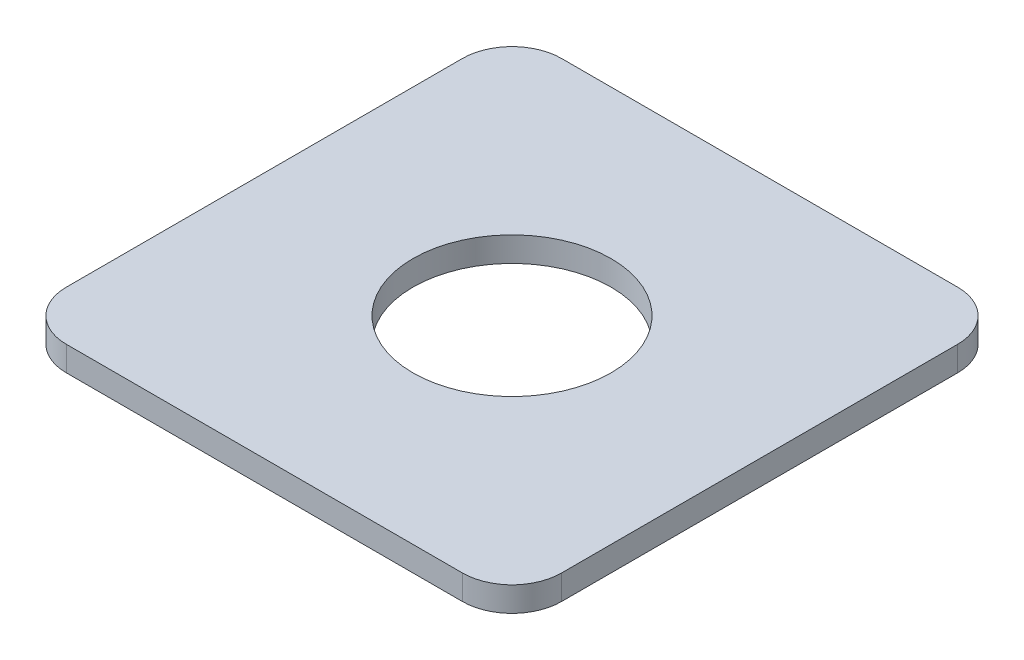
ISO-10303-21;
HEADER;
FILE_DESCRIPTION(('STEP AP214'),'2;1');
FILE_NAME('part.step','',(''),(''),'','','');
FILE_SCHEMA(('AUTOMOTIVE_DESIGN { 1 0 10303 214 1 1 1 1 }'));
ENDSEC;
DATA;
#1=APPLICATION_CONTEXT('core data for automotive mechanical design processes');
#2=APPLICATION_PROTOCOL_DEFINITION('international standard','automotive_design',2000,#1);
#3=PRODUCT_CONTEXT('',#1,'mechanical');
#4=PRODUCT('Part','Part','',(#3));
#5=PRODUCT_RELATED_PRODUCT_CATEGORY('part','',(#4));
#6=PRODUCT_DEFINITION_FORMATION('','',#4);
#7=PRODUCT_DEFINITION_CONTEXT('part definition',#1,'design');
#8=PRODUCT_DEFINITION('design','',#6,#7);
#9=PRODUCT_DEFINITION_SHAPE('','',#8);
#10=(LENGTH_UNIT() NAMED_UNIT(*) SI_UNIT(.MILLI.,.METRE.));
#11=(NAMED_UNIT(*) PLANE_ANGLE_UNIT() SI_UNIT($,.RADIAN.));
#12=(NAMED_UNIT(*) SI_UNIT($,.STERADIAN.) SOLID_ANGLE_UNIT());
#13=UNCERTAINTY_MEASURE_WITH_UNIT(LENGTH_MEASURE(1.E-05),#10,'distance_accuracy_value','');
#14=(GEOMETRIC_REPRESENTATION_CONTEXT(3) GLOBAL_UNCERTAINTY_ASSIGNED_CONTEXT((#13)) GLOBAL_UNIT_ASSIGNED_CONTEXT((#10,
#11,#12)) REPRESENTATION_CONTEXT('',''));
#15=CARTESIAN_POINT('',(0.,0.,0.));
#16=DIRECTION('',(0.,0.,1.));
#17=DIRECTION('',(1.,0.,0.));
#18=AXIS2_PLACEMENT_3D('',#15,#16,#17);
#19=CARTESIAN_POINT('',(-5.,0.5,-5.));
#20=DIRECTION('',(1.,0.,0.));
#21=DIRECTION('',(0.,0.,-1.));
#22=AXIS2_PLACEMENT_3D('',#19,#20,#21);
#23=PLANE('',#22);
#24=DIRECTION('',(0.,0.,1.));
#25=VECTOR('',#24,1.);
#26=CARTESIAN_POINT('',(-5.,0.,-5.));
#27=LINE('',#26,#25);
#28=CARTESIAN_POINT('',(-5.,0.,-4.));
#29=VERTEX_POINT('',#28);
#30=CARTESIAN_POINT('',(-5.,0.,4.));
#31=VERTEX_POINT('',#30);
#32=EDGE_CURVE('E156',#29,#31,#27,.T.);
#33=ORIENTED_EDGE('',*,*,#32,.T.);
#34=DIRECTION('',(0.,-1.,0.));
#35=VECTOR('',#34,1.);
#36=CARTESIAN_POINT('',(-5.,0.5,4.));
#37=LINE('',#36,#35);
#38=CARTESIAN_POINT('',(-5.,0.5,4.));
#39=VERTEX_POINT('',#38);
#40=EDGE_CURVE('E11',#31,#39,#37,.F.);
#41=ORIENTED_EDGE('',*,*,#40,.T.);
#42=DIRECTION('',(0.,0.,1.));
#43=VECTOR('',#42,1.);
#44=CARTESIAN_POINT('',(-5.,0.5,-5.));
#45=LINE('',#44,#43);
#46=CARTESIAN_POINT('',(-5.,0.5,-4.));
#47=VERTEX_POINT('',#46);
#48=EDGE_CURVE('E124',#47,#39,#45,.T.);
#49=ORIENTED_EDGE('',*,*,#48,.F.);
#50=DIRECTION('',(0.,-1.,0.));
#51=VECTOR('',#50,1.);
#52=CARTESIAN_POINT('',(-5.,0.5,-4.));
#53=LINE('',#52,#51);
#54=EDGE_CURVE('E40',#47,#29,#53,.T.);
#55=ORIENTED_EDGE('',*,*,#54,.T.);
#56=EDGE_LOOP('',(#33,#41,#49,#55));
#57=FACE_BOUND('',#56,.T.);
#58=ADVANCED_FACE('F32',(#57),#23,.F.);
#59=CARTESIAN_POINT('',(5.,0.5,5.));
#60=DIRECTION('',(0.,0.,-1.));
#61=DIRECTION('',(-1.,0.,0.));
#62=AXIS2_PLACEMENT_3D('',#59,#60,#61);
#63=PLANE('',#62);
#64=DIRECTION('',(1.,0.,0.));
#65=VECTOR('',#64,1.);
#66=CARTESIAN_POINT('',(5.,0.,5.));
#67=LINE('',#66,#65);
#68=CARTESIAN_POINT('',(-4.,0.,5.));
#69=VERTEX_POINT('',#68);
#70=CARTESIAN_POINT('',(4.,0.,5.));
#71=VERTEX_POINT('',#70);
#72=EDGE_CURVE('E129',#69,#71,#67,.T.);
#73=ORIENTED_EDGE('',*,*,#72,.T.);
#74=DIRECTION('',(0.,-1.,0.));
#75=VECTOR('',#74,1.);
#76=CARTESIAN_POINT('',(4.,0.5,5.));
#77=LINE('',#76,#75);
#78=CARTESIAN_POINT('',(4.,0.5,5.));
#79=VERTEX_POINT('',#78);
#80=EDGE_CURVE('E47',#71,#79,#77,.F.);
#81=ORIENTED_EDGE('',*,*,#80,.T.);
#82=DIRECTION('',(1.,0.,0.));
#83=VECTOR('',#82,1.);
#84=CARTESIAN_POINT('',(5.,0.5,5.));
#85=LINE('',#84,#83);
#86=CARTESIAN_POINT('',(-4.,0.5,5.));
#87=VERTEX_POINT('',#86);
#88=EDGE_CURVE('E127',#87,#79,#85,.T.);
#89=ORIENTED_EDGE('',*,*,#88,.F.);
#90=DIRECTION('',(0.,-1.,0.));
#91=VECTOR('',#90,1.);
#92=CARTESIAN_POINT('',(-4.,0.5,5.));
#93=LINE('',#92,#91);
#94=EDGE_CURVE('E148',#87,#69,#93,.T.);
#95=ORIENTED_EDGE('',*,*,#94,.T.);
#96=EDGE_LOOP('',(#73,#81,#89,#95));
#97=FACE_BOUND('',#96,.T.);
#98=ADVANCED_FACE('F187',(#97),#63,.F.);
#99=CARTESIAN_POINT('',(5.,0.5,-5.));
#100=DIRECTION('',(-1.,0.,0.));
#101=DIRECTION('',(0.,0.,1.));
#102=AXIS2_PLACEMENT_3D('',#99,#100,#101);
#103=PLANE('',#102);
#104=DIRECTION('',(0.,0.,-1.));
#105=VECTOR('',#104,1.);
#106=CARTESIAN_POINT('',(5.,0.,-5.));
#107=LINE('',#106,#105);
#108=CARTESIAN_POINT('',(5.,0.,4.));
#109=VERTEX_POINT('',#108);
#110=CARTESIAN_POINT('',(5.,0.,-4.));
#111=VERTEX_POINT('',#110);
#112=EDGE_CURVE('E125',#109,#111,#107,.T.);
#113=ORIENTED_EDGE('',*,*,#112,.T.);
#114=DIRECTION('',(0.,-1.,0.));
#115=VECTOR('',#114,1.);
#116=CARTESIAN_POINT('',(5.,0.5,-4.));
#117=LINE('',#116,#115);
#118=CARTESIAN_POINT('',(5.,0.5,-4.));
#119=VERTEX_POINT('',#118);
#120=EDGE_CURVE('E103',#111,#119,#117,.F.);
#121=ORIENTED_EDGE('',*,*,#120,.T.);
#122=DIRECTION('',(0.,0.,-1.));
#123=VECTOR('',#122,1.);
#124=CARTESIAN_POINT('',(5.,0.5,-5.));
#125=LINE('',#124,#123);
#126=CARTESIAN_POINT('',(5.,0.5,4.));
#127=VERTEX_POINT('',#126);
#128=EDGE_CURVE('E168',#127,#119,#125,.T.);
#129=ORIENTED_EDGE('',*,*,#128,.F.);
#130=DIRECTION('',(0.,-1.,0.));
#131=VECTOR('',#130,1.);
#132=CARTESIAN_POINT('',(5.,0.5,4.));
#133=LINE('',#132,#131);
#134=EDGE_CURVE('E108',#127,#109,#133,.T.);
#135=ORIENTED_EDGE('',*,*,#134,.T.);
#136=EDGE_LOOP('',(#113,#121,#129,#135));
#137=FACE_BOUND('',#136,.T.);
#138=ADVANCED_FACE('F184',(#137),#103,.F.);
#139=CARTESIAN_POINT('',(5.,0.5,-5.));
#140=DIRECTION('',(0.,0.,1.));
#141=DIRECTION('',(1.,0.,0.));
#142=AXIS2_PLACEMENT_3D('',#139,#140,#141);
#143=PLANE('',#142);
#144=DIRECTION('',(-1.,0.,0.));
#145=VECTOR('',#144,1.);
#146=CARTESIAN_POINT('',(5.,0.5,-5.));
#147=LINE('',#146,#145);
#148=CARTESIAN_POINT('',(4.,0.5,-5.));
#149=VERTEX_POINT('',#148);
#150=CARTESIAN_POINT('',(-4.,0.5,-5.));
#151=VERTEX_POINT('',#150);
#152=EDGE_CURVE('E118',#149,#151,#147,.T.);
#153=ORIENTED_EDGE('',*,*,#152,.F.);
#154=DIRECTION('',(0.,-1.,0.));
#155=VECTOR('',#154,1.);
#156=CARTESIAN_POINT('',(4.,0.5,-5.));
#157=LINE('',#156,#155);
#158=CARTESIAN_POINT('',(4.,0.,-5.));
#159=VERTEX_POINT('',#158);
#160=EDGE_CURVE('E102',#149,#159,#157,.T.);
#161=ORIENTED_EDGE('',*,*,#160,.T.);
#162=DIRECTION('',(-1.,0.,0.));
#163=VECTOR('',#162,1.);
#164=CARTESIAN_POINT('',(5.,0.,-5.));
#165=LINE('',#164,#163);
#166=CARTESIAN_POINT('',(-4.,0.,-5.));
#167=VERTEX_POINT('',#166);
#168=EDGE_CURVE('E115',#159,#167,#165,.T.);
#169=ORIENTED_EDGE('',*,*,#168,.T.);
#170=DIRECTION('',(0.,-1.,0.));
#171=VECTOR('',#170,1.);
#172=CARTESIAN_POINT('',(-4.,0.5,-5.));
#173=LINE('',#172,#171);
#174=EDGE_CURVE('E120',#167,#151,#173,.F.);
#175=ORIENTED_EDGE('',*,*,#174,.T.);
#176=EDGE_LOOP('',(#153,#161,#169,#175));
#177=FACE_BOUND('',#176,.T.);
#178=ADVANCED_FACE('F114',(#177),#143,.F.);
#179=CARTESIAN_POINT('',(0.,0.5,0.));
#180=DIRECTION('',(0.,-1.,0.));
#181=DIRECTION('',(0.,0.,-1.));
#182=AXIS2_PLACEMENT_3D('',#179,#180,#181);
#183=PLANE('',#182);
#184=CARTESIAN_POINT('',(0.,0.5,0.));
#185=DIRECTION('',(0.,1.,0.));
#186=DIRECTION('',(0.,0.,1.));
#187=AXIS2_PLACEMENT_3D('',#184,#185,#186);
#188=CIRCLE('',#187,2.);
#189=CARTESIAN_POINT('',(0.,0.5,2.));
#190=VERTEX_POINT('',#189);
#191=EDGE_CURVE('E164',#190,#190,#188,.T.);
#192=ORIENTED_EDGE('',*,*,#191,.F.);
#193=EDGE_LOOP('',(#192));
#194=FACE_BOUND('',#193,.T.);
#195=ORIENTED_EDGE('',*,*,#128,.T.);
#196=CARTESIAN_POINT('',(4.,0.5,-4.));
#197=DIRECTION('',(0.,-1.,0.));
#198=DIRECTION('',(0.,0.,-1.));
#199=AXIS2_PLACEMENT_3D('',#196,#197,#198);
#200=CIRCLE('',#199,1.);
#201=EDGE_CURVE('E146',#119,#149,#200,.F.);
#202=ORIENTED_EDGE('',*,*,#201,.T.);
#203=ORIENTED_EDGE('',*,*,#152,.T.);
#204=CARTESIAN_POINT('',(-4.,0.5,-4.));
#205=DIRECTION('',(0.,-1.,0.));
#206=DIRECTION('',(0.,0.,-1.));
#207=AXIS2_PLACEMENT_3D('',#204,#205,#206);
#208=CIRCLE('',#207,1.);
#209=EDGE_CURVE('E141',#151,#47,#208,.F.);
#210=ORIENTED_EDGE('',*,*,#209,.T.);
#211=ORIENTED_EDGE('',*,*,#48,.T.);
#212=CARTESIAN_POINT('',(-4.,0.5,4.));
#213=DIRECTION('',(0.,-1.,0.));
#214=DIRECTION('',(0.,0.,-1.));
#215=AXIS2_PLACEMENT_3D('',#212,#213,#214);
#216=CIRCLE('',#215,1.);
#217=EDGE_CURVE('E54',#39,#87,#216,.F.);
#218=ORIENTED_EDGE('',*,*,#217,.T.);
#219=ORIENTED_EDGE('',*,*,#88,.T.);
#220=CARTESIAN_POINT('',(4.,0.5,4.));
#221=DIRECTION('',(0.,-1.,0.));
#222=DIRECTION('',(0.,0.,-1.));
#223=AXIS2_PLACEMENT_3D('',#220,#221,#222);
#224=CIRCLE('',#223,1.);
#225=EDGE_CURVE('E144',#79,#127,#224,.F.);
#226=ORIENTED_EDGE('',*,*,#225,.T.);
#227=EDGE_LOOP('',(#195,#202,#203,#210,#211,#218,#219,#226));
#228=FACE_BOUND('',#227,.T.);
#229=ADVANCED_FACE('F177',(#194,#228),#183,.F.);
#230=CARTESIAN_POINT('',(0.,0.,0.));
#231=DIRECTION('',(0.,-1.,0.));
#232=DIRECTION('',(0.,0.,-1.));
#233=AXIS2_PLACEMENT_3D('',#230,#231,#232);
#234=PLANE('',#233);
#235=CARTESIAN_POINT('',(0.,0.,0.));
#236=DIRECTION('',(0.,1.,0.));
#237=DIRECTION('',(0.,0.,1.));
#238=AXIS2_PLACEMENT_3D('',#235,#236,#237);
#239=CIRCLE('',#238,2.);
#240=CARTESIAN_POINT('',(0.,0.,2.));
#241=VERTEX_POINT('',#240);
#242=EDGE_CURVE('E161',#241,#241,#239,.T.);
#243=ORIENTED_EDGE('',*,*,#242,.T.);
#244=EDGE_LOOP('',(#243));
#245=FACE_BOUND('',#244,.T.);
#246=ORIENTED_EDGE('',*,*,#168,.F.);
#247=CARTESIAN_POINT('',(4.,0.,-4.));
#248=DIRECTION('',(0.,-1.,0.));
#249=DIRECTION('',(0.,0.,-1.));
#250=AXIS2_PLACEMENT_3D('',#247,#248,#249);
#251=CIRCLE('',#250,1.);
#252=EDGE_CURVE('E98',#159,#111,#251,.T.);
#253=ORIENTED_EDGE('',*,*,#252,.T.);
#254=ORIENTED_EDGE('',*,*,#112,.F.);
#255=CARTESIAN_POINT('',(4.,0.,4.));
#256=DIRECTION('',(0.,-1.,0.));
#257=DIRECTION('',(0.,0.,-1.));
#258=AXIS2_PLACEMENT_3D('',#255,#256,#257);
#259=CIRCLE('',#258,1.);
#260=EDGE_CURVE('E109',#109,#71,#259,.T.);
#261=ORIENTED_EDGE('',*,*,#260,.T.);
#262=ORIENTED_EDGE('',*,*,#72,.F.);
#263=CARTESIAN_POINT('',(-4.,0.,4.));
#264=DIRECTION('',(0.,-1.,0.));
#265=DIRECTION('',(0.,0.,-1.));
#266=AXIS2_PLACEMENT_3D('',#263,#264,#265);
#267=CIRCLE('',#266,1.);
#268=EDGE_CURVE('E135',#69,#31,#267,.T.);
#269=ORIENTED_EDGE('',*,*,#268,.T.);
#270=ORIENTED_EDGE('',*,*,#32,.F.);
#271=CARTESIAN_POINT('',(-4.,0.,-4.));
#272=DIRECTION('',(0.,-1.,0.));
#273=DIRECTION('',(0.,0.,-1.));
#274=AXIS2_PLACEMENT_3D('',#271,#272,#273);
#275=CIRCLE('',#274,1.);
#276=EDGE_CURVE('E119',#29,#167,#275,.T.);
#277=ORIENTED_EDGE('',*,*,#276,.T.);
#278=EDGE_LOOP('',(#246,#253,#254,#261,#262,#269,#270,#277));
#279=FACE_BOUND('',#278,.T.);
#280=ADVANCED_FACE('F122',(#245,#279),#234,.T.);
#281=CARTESIAN_POINT('',(4.,0.5,-4.));
#282=DIRECTION('',(0.,-1.,0.));
#283=DIRECTION('',(0.,0.,-1.));
#284=AXIS2_PLACEMENT_3D('',#281,#282,#283);
#285=CYLINDRICAL_SURFACE('',#284,1.);
#286=ORIENTED_EDGE('',*,*,#201,.F.);
#287=ORIENTED_EDGE('',*,*,#120,.F.);
#288=ORIENTED_EDGE('',*,*,#252,.F.);
#289=ORIENTED_EDGE('',*,*,#160,.F.);
#290=EDGE_LOOP('',(#286,#287,#288,#289));
#291=FACE_BOUND('',#290,.T.);
#292=ADVANCED_FACE('F101',(#291),#285,.T.);
#293=CARTESIAN_POINT('',(4.,0.5,4.));
#294=DIRECTION('',(0.,-1.,0.));
#295=DIRECTION('',(0.,0.,-1.));
#296=AXIS2_PLACEMENT_3D('',#293,#294,#295);
#297=CYLINDRICAL_SURFACE('',#296,1.);
#298=ORIENTED_EDGE('',*,*,#225,.F.);
#299=ORIENTED_EDGE('',*,*,#80,.F.);
#300=ORIENTED_EDGE('',*,*,#260,.F.);
#301=ORIENTED_EDGE('',*,*,#134,.F.);
#302=EDGE_LOOP('',(#298,#299,#300,#301));
#303=FACE_BOUND('',#302,.T.);
#304=ADVANCED_FACE('F186',(#303),#297,.T.);
#305=CARTESIAN_POINT('',(-4.,0.5,4.));
#306=DIRECTION('',(0.,-1.,0.));
#307=DIRECTION('',(0.,0.,-1.));
#308=AXIS2_PLACEMENT_3D('',#305,#306,#307);
#309=CYLINDRICAL_SURFACE('',#308,1.);
#310=ORIENTED_EDGE('',*,*,#217,.F.);
#311=ORIENTED_EDGE('',*,*,#40,.F.);
#312=ORIENTED_EDGE('',*,*,#268,.F.);
#313=ORIENTED_EDGE('',*,*,#94,.F.);
#314=EDGE_LOOP('',(#310,#311,#312,#313));
#315=FACE_BOUND('',#314,.T.);
#316=ADVANCED_FACE('F190',(#315),#309,.T.);
#317=CARTESIAN_POINT('',(-4.,0.5,-4.));
#318=DIRECTION('',(0.,-1.,0.));
#319=DIRECTION('',(0.,0.,-1.));
#320=AXIS2_PLACEMENT_3D('',#317,#318,#319);
#321=CYLINDRICAL_SURFACE('',#320,1.);
#322=ORIENTED_EDGE('',*,*,#209,.F.);
#323=ORIENTED_EDGE('',*,*,#174,.F.);
#324=ORIENTED_EDGE('',*,*,#276,.F.);
#325=ORIENTED_EDGE('',*,*,#54,.F.);
#326=EDGE_LOOP('',(#322,#323,#324,#325));
#327=FACE_BOUND('',#326,.T.);
#328=ADVANCED_FACE('F34',(#327),#321,.T.);
#329=CARTESIAN_POINT('',(0.,0.,0.));
#330=DIRECTION('',(0.,1.,0.));
#331=DIRECTION('',(0.,0.,1.));
#332=AXIS2_PLACEMENT_3D('',#329,#330,#331);
#333=CYLINDRICAL_SURFACE('',#332,2.);
#334=ORIENTED_EDGE('',*,*,#242,.F.);
#335=EDGE_LOOP('',(#334));
#336=FACE_BOUND('',#335,.T.);
#337=ORIENTED_EDGE('',*,*,#191,.T.);
#338=EDGE_LOOP('',(#337));
#339=FACE_BOUND('',#338,.T.);
#340=ADVANCED_FACE('F175',(#336,#339),#333,.F.);
#341=CLOSED_SHELL('',(#58,#98,#138,#178,#229,#280,#292,#304,#316,#328,#340));
#342=MANIFOLD_SOLID_BREP('B2',#341);
#343=ADVANCED_BREP_SHAPE_REPRESENTATION('',(#18,#342),#14);
#344=SHAPE_DEFINITION_REPRESENTATION(#9,#343);
ENDSEC;
END-ISO-10303-21;
